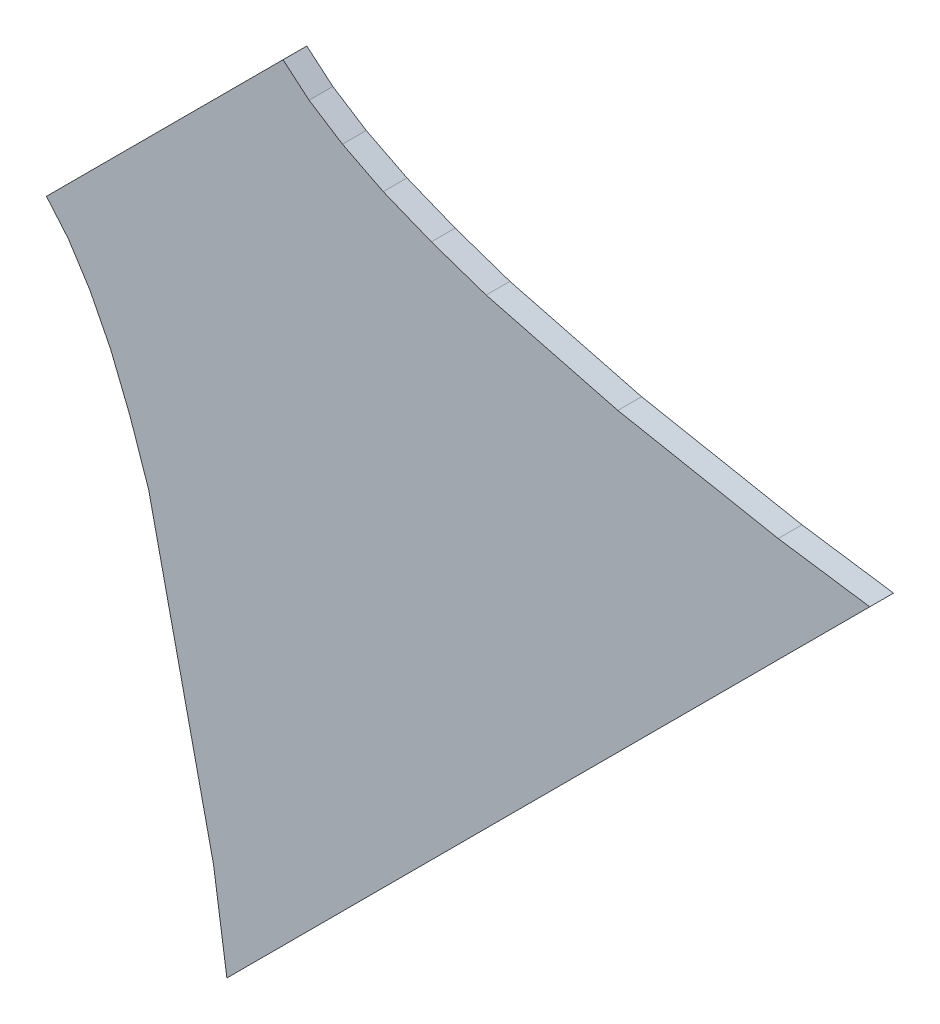
ISO-10303-21;
HEADER;
FILE_DESCRIPTION(('STEP AP214'),'2;1');
FILE_NAME('part.step','',(''),(''),'','','');
FILE_SCHEMA(('AUTOMOTIVE_DESIGN { 1 0 10303 214 1 1 1 1 }'));
ENDSEC;
DATA;
#1=APPLICATION_CONTEXT('core data for automotive mechanical design processes');
#2=APPLICATION_PROTOCOL_DEFINITION('international standard','automotive_design',2000,#1);
#3=PRODUCT_CONTEXT('',#1,'mechanical');
#4=PRODUCT('Part','Part','',(#3));
#5=PRODUCT_RELATED_PRODUCT_CATEGORY('part','',(#4));
#6=PRODUCT_DEFINITION_FORMATION('','',#4);
#7=PRODUCT_DEFINITION_CONTEXT('part definition',#1,'design');
#8=PRODUCT_DEFINITION('design','',#6,#7);
#9=PRODUCT_DEFINITION_SHAPE('','',#8);
#10=(LENGTH_UNIT() NAMED_UNIT(*) SI_UNIT(.MILLI.,.METRE.));
#11=(NAMED_UNIT(*) PLANE_ANGLE_UNIT() SI_UNIT($,.RADIAN.));
#12=(NAMED_UNIT(*) SI_UNIT($,.STERADIAN.) SOLID_ANGLE_UNIT());
#13=UNCERTAINTY_MEASURE_WITH_UNIT(LENGTH_MEASURE(1.E-05),#10,'distance_accuracy_value','');
#14=(GEOMETRIC_REPRESENTATION_CONTEXT(3) GLOBAL_UNCERTAINTY_ASSIGNED_CONTEXT((#13)) GLOBAL_UNIT_ASSIGNED_CONTEXT((#10,
#11,#12)) REPRESENTATION_CONTEXT('',''));
#15=CARTESIAN_POINT('',(0.,0.,0.));
#16=DIRECTION('',(0.,0.,1.));
#17=DIRECTION('',(1.,0.,0.));
#18=AXIS2_PLACEMENT_3D('',#15,#16,#17);
#19=CARTESIAN_POINT('',(116.087997436523,63.3779983520508,0.));
#20=DIRECTION('',(0.763321140932524,0.646019222473658,0.));
#21=DIRECTION('',(0.646019222473658,-0.763321140932524,0.));
#22=AXIS2_PLACEMENT_3D('',#19,#20,#21);
#23=PLANE('',#22);
#24=DIRECTION('',(0.646019222473658,-0.763321140932524,0.));
#25=VECTOR('',#24,1.);
#26=CARTESIAN_POINT('',(116.087997436523,63.3779983520508,0.03556));
#27=LINE('',#26,#25);
#28=CARTESIAN_POINT('',(116.087997436523,63.3779983520508,0.03556));
#29=VERTEX_POINT('',#28);
#30=CARTESIAN_POINT('',(116.121002197266,63.3390007019043,0.03556));
#31=VERTEX_POINT('',#30);
#32=EDGE_CURVE('E11',#29,#31,#27,.T.);
#33=ORIENTED_EDGE('',*,*,#32,.F.);
#34=DIRECTION('',(0.,0.,1.));
#35=VECTOR('',#34,1.);
#36=CARTESIAN_POINT('',(116.087997436523,63.3779983520508,0.));
#37=LINE('',#36,#35);
#38=CARTESIAN_POINT('',(116.087997436523,63.3779983520508,0.));
#39=VERTEX_POINT('',#38);
#40=EDGE_CURVE('E24',#39,#29,#37,.T.);
#41=ORIENTED_EDGE('',*,*,#40,.F.);
#42=DIRECTION('',(0.646019222473658,-0.763321140932524,0.));
#43=VECTOR('',#42,1.);
#44=CARTESIAN_POINT('',(116.087997436523,63.3779983520508,0.));
#45=LINE('',#44,#43);
#46=CARTESIAN_POINT('',(116.121002197266,63.3390007019043,0.));
#47=VERTEX_POINT('',#46);
#48=EDGE_CURVE('E154',#39,#47,#45,.T.);
#49=ORIENTED_EDGE('',*,*,#48,.T.);
#50=DIRECTION('',(0.,0.,1.));
#51=VECTOR('',#50,1.);
#52=CARTESIAN_POINT('',(116.121002197266,63.3390007019043,0.));
#53=LINE('',#52,#51);
#54=EDGE_CURVE('E37',#47,#31,#53,.T.);
#55=ORIENTED_EDGE('',*,*,#54,.T.);
#56=EDGE_LOOP('',(#33,#41,#49,#55));
#57=FACE_BOUND('',#56,.T.);
#58=ADVANCED_FACE('F17',(#57),#23,.F.);
#59=CARTESIAN_POINT('',(116.121002197266,63.3390007019043,0.));
#60=DIRECTION('',(0.842285405318662,0.53903181352048,0.));
#61=DIRECTION('',(0.53903181352048,-0.842285405318662,0.));
#62=AXIS2_PLACEMENT_3D('',#59,#60,#61);
#63=PLANE('',#62);
#64=DIRECTION('',(0.53903181352048,-0.842285405318662,0.));
#65=VECTOR('',#64,1.);
#66=CARTESIAN_POINT('',(116.121002197266,63.3390007019043,0.03556));
#67=LINE('',#66,#65);
#68=CARTESIAN_POINT('',(116.15299987793,63.2890014648437,0.03556));
#69=VERTEX_POINT('',#68);
#70=EDGE_CURVE('E266',#31,#69,#67,.T.);
#71=ORIENTED_EDGE('',*,*,#70,.F.);
#72=ORIENTED_EDGE('',*,*,#54,.F.);
#73=DIRECTION('',(0.53903181352048,-0.842285405318662,0.));
#74=VECTOR('',#73,1.);
#75=CARTESIAN_POINT('',(116.121002197266,63.3390007019043,0.));
#76=LINE('',#75,#74);
#77=CARTESIAN_POINT('',(116.15299987793,63.2890014648437,0.));
#78=VERTEX_POINT('',#77);
#79=EDGE_CURVE('E263',#47,#78,#76,.T.);
#80=ORIENTED_EDGE('',*,*,#79,.T.);
#81=DIRECTION('',(0.,0.,1.));
#82=VECTOR('',#81,1.);
#83=CARTESIAN_POINT('',(116.15299987793,63.2890014648437,0.));
#84=LINE('',#83,#82);
#85=EDGE_CURVE('E261',#78,#69,#84,.T.);
#86=ORIENTED_EDGE('',*,*,#85,.T.);
#87=EDGE_LOOP('',(#71,#72,#80,#86));
#88=FACE_BOUND('',#87,.T.);
#89=ADVANCED_FACE('F274',(#88),#63,.F.);
#90=CARTESIAN_POINT('',(116.15299987793,63.2890014648438,0.));
#91=DIRECTION('',(0.891498104082583,0.453024425850483,0.));
#92=DIRECTION('',(0.453024425850483,-0.891498104082583,0.));
#93=AXIS2_PLACEMENT_3D('',#90,#91,#92);
#94=PLANE('',#93);
#95=DIRECTION('',(0.453024425850483,-0.891498104082583,0.));
#96=VECTOR('',#95,1.);
#97=CARTESIAN_POINT('',(116.15299987793,63.2890014648437,0.03556));
#98=LINE('',#97,#96);
#99=CARTESIAN_POINT('',(116.18399810791,63.2280006408691,0.03556));
#100=VERTEX_POINT('',#99);
#101=EDGE_CURVE('E258',#69,#100,#98,.T.);
#102=ORIENTED_EDGE('',*,*,#101,.F.);
#103=ORIENTED_EDGE('',*,*,#85,.F.);
#104=DIRECTION('',(0.453024425850483,-0.891498104082583,0.));
#105=VECTOR('',#104,1.);
#106=CARTESIAN_POINT('',(116.15299987793,63.2890014648437,0.));
#107=LINE('',#106,#105);
#108=CARTESIAN_POINT('',(116.18399810791,63.2280006408691,0.));
#109=VERTEX_POINT('',#108);
#110=EDGE_CURVE('E255',#78,#109,#107,.T.);
#111=ORIENTED_EDGE('',*,*,#110,.T.);
#112=DIRECTION('',(0.,0.,1.));
#113=VECTOR('',#112,1.);
#114=CARTESIAN_POINT('',(116.18399810791,63.2280006408691,0.));
#115=LINE('',#114,#113);
#116=EDGE_CURVE('E253',#109,#100,#115,.T.);
#117=ORIENTED_EDGE('',*,*,#116,.T.);
#118=EDGE_LOOP('',(#102,#103,#111,#117));
#119=FACE_BOUND('',#118,.T.);
#120=ADVANCED_FACE('F280',(#119),#94,.F.);
#121=CARTESIAN_POINT('',(116.18399810791,63.2280006408691,0.));
#122=DIRECTION('',(0.927592874693312,0.373592637532109,0.));
#123=DIRECTION('',(0.373592637532109,-0.927592874693312,0.));
#124=AXIS2_PLACEMENT_3D('',#121,#122,#123);
#125=PLANE('',#124);
#126=DIRECTION('',(0.373592637532109,-0.927592874693312,0.));
#127=VECTOR('',#126,1.);
#128=CARTESIAN_POINT('',(116.18399810791,63.2280006408691,0.03556));
#129=LINE('',#128,#127);
#130=CARTESIAN_POINT('',(116.212997436523,63.1559982299805,0.03556));
#131=VERTEX_POINT('',#130);
#132=EDGE_CURVE('E250',#100,#131,#129,.T.);
#133=ORIENTED_EDGE('',*,*,#132,.F.);
#134=ORIENTED_EDGE('',*,*,#116,.F.);
#135=DIRECTION('',(0.373592637532109,-0.927592874693312,0.));
#136=VECTOR('',#135,1.);
#137=CARTESIAN_POINT('',(116.18399810791,63.2280006408691,0.));
#138=LINE('',#137,#136);
#139=CARTESIAN_POINT('',(116.212997436523,63.1559982299805,0.));
#140=VERTEX_POINT('',#139);
#141=EDGE_CURVE('E247',#109,#140,#138,.T.);
#142=ORIENTED_EDGE('',*,*,#141,.T.);
#143=DIRECTION('',(0.,0.,1.));
#144=VECTOR('',#143,1.);
#145=CARTESIAN_POINT('',(116.212997436523,63.1559982299805,0.));
#146=LINE('',#145,#144);
#147=EDGE_CURVE('E245',#140,#131,#146,.T.);
#148=ORIENTED_EDGE('',*,*,#147,.T.);
#149=EDGE_LOOP('',(#133,#134,#142,#148));
#150=FACE_BOUND('',#149,.T.);
#151=ADVANCED_FACE('F282',(#150),#125,.F.);
#152=CARTESIAN_POINT('',(116.212997436523,63.1559982299805,0.));
#153=DIRECTION('',(0.946346572220429,0.323153470113885,0.));
#154=DIRECTION('',(0.323153470113885,-0.946346572220429,0.));
#155=AXIS2_PLACEMENT_3D('',#152,#153,#154);
#156=PLANE('',#155);
#157=DIRECTION('',(0.323153470113884,-0.946346572220429,0.));
#158=VECTOR('',#157,1.);
#159=CARTESIAN_POINT('',(116.212997436523,63.1559982299805,0.03556));
#160=LINE('',#159,#158);
#161=CARTESIAN_POINT('',(116.240997314453,63.0740013122559,0.03556));
#162=VERTEX_POINT('',#161);
#163=EDGE_CURVE('E242',#131,#162,#160,.T.);
#164=ORIENTED_EDGE('',*,*,#163,.F.);
#165=ORIENTED_EDGE('',*,*,#147,.F.);
#166=DIRECTION('',(0.323153470113884,-0.946346572220429,0.));
#167=VECTOR('',#166,1.);
#168=CARTESIAN_POINT('',(116.212997436523,63.1559982299805,0.));
#169=LINE('',#168,#167);
#170=CARTESIAN_POINT('',(116.240997314453,63.0740013122559,0.));
#171=VERTEX_POINT('',#170);
#172=EDGE_CURVE('E239',#140,#171,#169,.T.);
#173=ORIENTED_EDGE('',*,*,#172,.T.);
#174=DIRECTION('',(0.,0.,1.));
#175=VECTOR('',#174,1.);
#176=CARTESIAN_POINT('',(116.240997314453,63.0740013122559,0.));
#177=LINE('',#176,#175);
#178=EDGE_CURVE('E237',#171,#162,#177,.T.);
#179=ORIENTED_EDGE('',*,*,#178,.T.);
#180=EDGE_LOOP('',(#164,#165,#173,#179));
#181=FACE_BOUND('',#180,.T.);
#182=ADVANCED_FACE('F287',(#181),#156,.F.);
#183=CARTESIAN_POINT('',(116.240997314453,63.0740013122559,0.));
#184=DIRECTION('',(0.976239566364474,0.21669404482935,0.));
#185=DIRECTION('',(0.21669404482935,-0.976239566364474,0.));
#186=AXIS2_PLACEMENT_3D('',#183,#184,#185);
#187=PLANE('',#186);
#188=DIRECTION('',(0.21669404482935,-0.976239566364474,0.));
#189=VECTOR('',#188,1.);
#190=CARTESIAN_POINT('',(116.240997314453,63.0740013122559,0.03556));
#191=LINE('',#190,#189);
#192=CARTESIAN_POINT('',(116.337997436523,62.6370010375977,0.03556));
#193=VERTEX_POINT('',#192);
#194=EDGE_CURVE('E234',#162,#193,#191,.T.);
#195=ORIENTED_EDGE('',*,*,#194,.F.);
#196=ORIENTED_EDGE('',*,*,#178,.F.);
#197=DIRECTION('',(0.21669404482935,-0.976239566364474,0.));
#198=VECTOR('',#197,1.);
#199=CARTESIAN_POINT('',(116.240997314453,63.0740013122559,0.));
#200=LINE('',#199,#198);
#201=CARTESIAN_POINT('',(116.337997436523,62.6370010375977,0.));
#202=VERTEX_POINT('',#201);
#203=EDGE_CURVE('E231',#171,#202,#200,.T.);
#204=ORIENTED_EDGE('',*,*,#203,.T.);
#205=DIRECTION('',(0.,0.,1.));
#206=VECTOR('',#205,1.);
#207=CARTESIAN_POINT('',(116.337997436523,62.6370010375977,0.));
#208=LINE('',#207,#206);
#209=EDGE_CURVE('E229',#202,#193,#208,.T.);
#210=ORIENTED_EDGE('',*,*,#209,.T.);
#211=EDGE_LOOP('',(#195,#196,#204,#210));
#212=FACE_BOUND('',#211,.T.);
#213=ADVANCED_FACE('F290',(#212),#187,.F.);
#214=CARTESIAN_POINT('',(116.337997436523,62.6370010375977,0.));
#215=DIRECTION('',(0.989507228145711,0.144483374294039,0.));
#216=DIRECTION('',(0.144483374294039,-0.989507228145711,0.));
#217=AXIS2_PLACEMENT_3D('',#214,#215,#216);
#218=PLANE('',#217);
#219=DIRECTION('',(0.144483374294039,-0.989507228145711,0.));
#220=VECTOR('',#219,1.);
#221=CARTESIAN_POINT('',(116.337997436523,62.6370010375977,0.03556));
#222=LINE('',#221,#220);
#223=CARTESIAN_POINT('',(116.358001708984,62.5,0.03556));
#224=VERTEX_POINT('',#223);
#225=EDGE_CURVE('E226',#193,#224,#222,.T.);
#226=ORIENTED_EDGE('',*,*,#225,.F.);
#227=ORIENTED_EDGE('',*,*,#209,.F.);
#228=DIRECTION('',(0.144483374294039,-0.989507228145711,0.));
#229=VECTOR('',#228,1.);
#230=CARTESIAN_POINT('',(116.337997436523,62.6370010375977,0.));
#231=LINE('',#230,#229);
#232=CARTESIAN_POINT('',(116.358001708984,62.5,0.));
#233=VERTEX_POINT('',#232);
#234=EDGE_CURVE('E223',#202,#233,#231,.T.);
#235=ORIENTED_EDGE('',*,*,#234,.T.);
#236=DIRECTION('',(0.,0.,1.));
#237=VECTOR('',#236,1.);
#238=CARTESIAN_POINT('',(116.358001708984,62.5,0.));
#239=LINE('',#238,#237);
#240=EDGE_CURVE('E221',#233,#224,#239,.T.);
#241=ORIENTED_EDGE('',*,*,#240,.T.);
#242=EDGE_LOOP('',(#226,#227,#235,#241));
#243=FACE_BOUND('',#242,.T.);
#244=ADVANCED_FACE('F295',(#243),#218,.F.);
#245=CARTESIAN_POINT('',(116.358001708984,62.5,0.));
#246=DIRECTION('',(-0.707108183159484,0.707105379210831,0.));
#247=DIRECTION('',(0.707105379210831,0.707108183159484,0.));
#248=AXIS2_PLACEMENT_3D('',#245,#246,#247);
#249=PLANE('',#248);
#250=DIRECTION('',(0.707105379210831,0.707108183159484,0.));
#251=VECTOR('',#250,1.);
#252=CARTESIAN_POINT('',(116.358001708984,62.5,0.03556));
#253=LINE('',#252,#251);
#254=CARTESIAN_POINT('',(117.319999694824,63.4620018005371,0.03556));
#255=VERTEX_POINT('',#254);
#256=EDGE_CURVE('E218',#224,#255,#253,.T.);
#257=ORIENTED_EDGE('',*,*,#256,.F.);
#258=ORIENTED_EDGE('',*,*,#240,.F.);
#259=DIRECTION('',(0.707105379210831,0.707108183159484,0.));
#260=VECTOR('',#259,1.);
#261=CARTESIAN_POINT('',(116.358001708984,62.5,0.));
#262=LINE('',#261,#260);
#263=CARTESIAN_POINT('',(117.319999694824,63.4620018005371,0.));
#264=VERTEX_POINT('',#263);
#265=EDGE_CURVE('E215',#233,#264,#262,.T.);
#266=ORIENTED_EDGE('',*,*,#265,.T.);
#267=DIRECTION('',(0.,0.,1.));
#268=VECTOR('',#267,1.);
#269=CARTESIAN_POINT('',(117.319999694824,63.4620018005371,0.));
#270=LINE('',#269,#268);
#271=EDGE_CURVE('E213',#264,#255,#270,.T.);
#272=ORIENTED_EDGE('',*,*,#271,.T.);
#273=EDGE_LOOP('',(#257,#258,#266,#272));
#274=FACE_BOUND('',#273,.T.);
#275=ADVANCED_FACE('F298',(#274),#249,.F.);
#276=CARTESIAN_POINT('',(117.319999694824,63.4620018005371,0.));
#277=DIRECTION('',(-0.144429419714034,-0.989515104847353,0.));
#278=DIRECTION('',(-0.989515104847353,0.144429419714034,0.));
#279=AXIS2_PLACEMENT_3D('',#276,#277,#278);
#280=PLANE('',#279);
#281=DIRECTION('',(-0.989515104847353,0.144429419714034,0.));
#282=VECTOR('',#281,1.);
#283=CARTESIAN_POINT('',(117.319999694824,63.4620018005371,0.03556));
#284=LINE('',#283,#282);
#285=CARTESIAN_POINT('',(117.182998657227,63.4819984436035,0.03556));
#286=VERTEX_POINT('',#285);
#287=EDGE_CURVE('E210',#255,#286,#284,.T.);
#288=ORIENTED_EDGE('',*,*,#287,.F.);
#289=ORIENTED_EDGE('',*,*,#271,.F.);
#290=DIRECTION('',(-0.989515104847353,0.144429419714034,0.));
#291=VECTOR('',#290,1.);
#292=CARTESIAN_POINT('',(117.319999694824,63.4620018005371,0.));
#293=LINE('',#292,#291);
#294=CARTESIAN_POINT('',(117.182998657227,63.4819984436035,0.));
#295=VERTEX_POINT('',#294);
#296=EDGE_CURVE('E207',#264,#295,#293,.T.);
#297=ORIENTED_EDGE('',*,*,#296,.T.);
#298=DIRECTION('',(0.,0.,1.));
#299=VECTOR('',#298,1.);
#300=CARTESIAN_POINT('',(117.182998657227,63.4819984436035,0.));
#301=LINE('',#300,#299);
#302=EDGE_CURVE('E205',#295,#286,#301,.T.);
#303=ORIENTED_EDGE('',*,*,#302,.T.);
#304=EDGE_LOOP('',(#288,#289,#297,#303));
#305=FACE_BOUND('',#304,.T.);
#306=ADVANCED_FACE('F303',(#305),#280,.F.);
#307=CARTESIAN_POINT('',(117.182998657227,63.4819984436035,0.));
#308=DIRECTION('',(-0.188247521686803,-0.982121617000042,0.));
#309=DIRECTION('',(-0.982121617000042,0.188247521686803,0.));
#310=AXIS2_PLACEMENT_3D('',#307,#308,#309);
#311=PLANE('',#310);
#312=DIRECTION('',(-0.982121617000042,0.188247521686803,0.));
#313=VECTOR('',#312,1.);
#314=CARTESIAN_POINT('',(117.182998657227,63.4819984436035,0.03556));
#315=LINE('',#314,#313);
#316=CARTESIAN_POINT('',(116.943000793457,63.5279998779297,0.03556));
#317=VERTEX_POINT('',#316);
#318=EDGE_CURVE('E202',#286,#317,#315,.T.);
#319=ORIENTED_EDGE('',*,*,#318,.F.);
#320=ORIENTED_EDGE('',*,*,#302,.F.);
#321=DIRECTION('',(-0.982121617000042,0.188247521686803,0.));
#322=VECTOR('',#321,1.);
#323=CARTESIAN_POINT('',(117.182998657227,63.4819984436035,0.));
#324=LINE('',#323,#322);
#325=CARTESIAN_POINT('',(116.943000793457,63.5279998779297,0.));
#326=VERTEX_POINT('',#325);
#327=EDGE_CURVE('E199',#295,#326,#324,.T.);
#328=ORIENTED_EDGE('',*,*,#327,.T.);
#329=DIRECTION('',(0.,0.,1.));
#330=VECTOR('',#329,1.);
#331=CARTESIAN_POINT('',(116.943000793457,63.5279998779297,0.));
#332=LINE('',#331,#330);
#333=EDGE_CURVE('E197',#326,#317,#332,.T.);
#334=ORIENTED_EDGE('',*,*,#333,.T.);
#335=EDGE_LOOP('',(#319,#320,#328,#334));
#336=FACE_BOUND('',#335,.T.);
#337=ADVANCED_FACE('F306',(#336),#311,.F.);
#338=CARTESIAN_POINT('',(116.943000793457,63.5279998779297,0.));
#339=DIRECTION('',(-0.250616689178286,-0.96808639857469,0.));
#340=DIRECTION('',(-0.96808639857469,0.250616689178286,0.));
#341=AXIS2_PLACEMENT_3D('',#338,#339,#340);
#342=PLANE('',#341);
#343=DIRECTION('',(-0.96808639857469,0.250616689178286,0.));
#344=VECTOR('',#343,1.);
#345=CARTESIAN_POINT('',(116.943000793457,63.5279998779297,0.03556));
#346=LINE('',#345,#344);
#347=CARTESIAN_POINT('',(116.746002197266,63.5789985656738,0.03556));
#348=VERTEX_POINT('',#347);
#349=EDGE_CURVE('E194',#317,#348,#346,.T.);
#350=ORIENTED_EDGE('',*,*,#349,.F.);
#351=ORIENTED_EDGE('',*,*,#333,.F.);
#352=DIRECTION('',(-0.96808639857469,0.250616689178286,0.));
#353=VECTOR('',#352,1.);
#354=CARTESIAN_POINT('',(116.943000793457,63.5279998779297,0.));
#355=LINE('',#354,#353);
#356=CARTESIAN_POINT('',(116.746002197266,63.5789985656738,0.));
#357=VERTEX_POINT('',#356);
#358=EDGE_CURVE('E191',#326,#357,#355,.T.);
#359=ORIENTED_EDGE('',*,*,#358,.T.);
#360=DIRECTION('',(0.,0.,1.));
#361=VECTOR('',#360,1.);
#362=CARTESIAN_POINT('',(116.746002197266,63.5789985656738,0.));
#363=LINE('',#362,#361);
#364=EDGE_CURVE('E189',#357,#348,#363,.T.);
#365=ORIENTED_EDGE('',*,*,#364,.T.);
#366=EDGE_LOOP('',(#350,#351,#359,#365));
#367=FACE_BOUND('',#366,.T.);
#368=ADVANCED_FACE('F311',(#367),#342,.F.);
#369=CARTESIAN_POINT('',(116.746002197266,63.5789985656738,0.));
#370=DIRECTION('',(-0.323140006713482,-0.946351169524934,0.));
#371=DIRECTION('',(-0.946351169524934,0.323140006713482,0.));
#372=AXIS2_PLACEMENT_3D('',#369,#370,#371);
#373=PLANE('',#372);
#374=DIRECTION('',(-0.946351169524934,0.323140006713482,0.));
#375=VECTOR('',#374,1.);
#376=CARTESIAN_POINT('',(116.746002197266,63.5789985656738,0.03556));
#377=LINE('',#376,#375);
#378=CARTESIAN_POINT('',(116.664001464844,63.6069984436035,0.03556));
#379=VERTEX_POINT('',#378);
#380=EDGE_CURVE('E186',#348,#379,#377,.T.);
#381=ORIENTED_EDGE('',*,*,#380,.F.);
#382=ORIENTED_EDGE('',*,*,#364,.F.);
#383=DIRECTION('',(-0.946351169524934,0.323140006713482,0.));
#384=VECTOR('',#383,1.);
#385=CARTESIAN_POINT('',(116.746002197266,63.5789985656738,0.));
#386=LINE('',#385,#384);
#387=CARTESIAN_POINT('',(116.664001464844,63.6069984436035,0.));
#388=VERTEX_POINT('',#387);
#389=EDGE_CURVE('E183',#357,#388,#386,.T.);
#390=ORIENTED_EDGE('',*,*,#389,.T.);
#391=DIRECTION('',(0.,0.,1.));
#392=VECTOR('',#391,1.);
#393=CARTESIAN_POINT('',(116.664001464844,63.6069984436035,0.));
#394=LINE('',#393,#392);
#395=EDGE_CURVE('E181',#388,#379,#394,.T.);
#396=ORIENTED_EDGE('',*,*,#395,.T.);
#397=EDGE_LOOP('',(#381,#382,#390,#396));
#398=FACE_BOUND('',#397,.T.);
#399=ADVANCED_FACE('F314',(#398),#373,.F.);
#400=CARTESIAN_POINT('',(116.664001464844,63.6069984436035,0.));
#401=DIRECTION('',(-0.373651953728889,-0.927568982596219,0.));
#402=DIRECTION('',(-0.927568982596219,0.373651953728889,0.));
#403=AXIS2_PLACEMENT_3D('',#400,#401,#402);
#404=PLANE('',#403);
#405=DIRECTION('',(-0.927568982596219,0.373651953728889,0.));
#406=VECTOR('',#405,1.);
#407=CARTESIAN_POINT('',(116.664001464844,63.6069984436035,0.03556));
#408=LINE('',#407,#406);
#409=CARTESIAN_POINT('',(116.592002868652,63.6360015869141,0.03556));
#410=VERTEX_POINT('',#409);
#411=EDGE_CURVE('E178',#379,#410,#408,.T.);
#412=ORIENTED_EDGE('',*,*,#411,.F.);
#413=ORIENTED_EDGE('',*,*,#395,.F.);
#414=DIRECTION('',(-0.927568982596219,0.373651953728889,0.));
#415=VECTOR('',#414,1.);
#416=CARTESIAN_POINT('',(116.664001464844,63.6069984436035,0.));
#417=LINE('',#416,#415);
#418=CARTESIAN_POINT('',(116.592002868652,63.6360015869141,0.));
#419=VERTEX_POINT('',#418);
#420=EDGE_CURVE('E175',#388,#419,#417,.T.);
#421=ORIENTED_EDGE('',*,*,#420,.T.);
#422=DIRECTION('',(0.,0.,1.));
#423=VECTOR('',#422,1.);
#424=CARTESIAN_POINT('',(116.592002868652,63.6360015869141,0.));
#425=LINE('',#424,#423);
#426=EDGE_CURVE('E173',#419,#410,#425,.T.);
#427=ORIENTED_EDGE('',*,*,#426,.T.);
#428=EDGE_LOOP('',(#412,#413,#421,#427));
#429=FACE_BOUND('',#428,.T.);
#430=ADVANCED_FACE('F319',(#429),#404,.F.);
#431=CARTESIAN_POINT('',(116.592002868652,63.6360015869141,0.));
#432=DIRECTION('',(-0.453001911052971,-0.891509544863293,0.));
#433=DIRECTION('',(-0.891509544863293,0.453001911052971,0.));
#434=AXIS2_PLACEMENT_3D('',#431,#432,#433);
#435=PLANE('',#434);
#436=DIRECTION('',(-0.891509544863293,0.453001911052971,0.));
#437=VECTOR('',#436,1.);
#438=CARTESIAN_POINT('',(116.592002868652,63.6360015869141,0.03556));
#439=LINE('',#438,#437);
#440=CARTESIAN_POINT('',(116.53099822998,63.6669998168945,0.03556));
#441=VERTEX_POINT('',#440);
#442=EDGE_CURVE('E170',#410,#441,#439,.T.);
#443=ORIENTED_EDGE('',*,*,#442,.F.);
#444=ORIENTED_EDGE('',*,*,#426,.F.);
#445=DIRECTION('',(-0.891509544863293,0.453001911052971,0.));
#446=VECTOR('',#445,1.);
#447=CARTESIAN_POINT('',(116.592002868652,63.6360015869141,0.));
#448=LINE('',#447,#446);
#449=CARTESIAN_POINT('',(116.53099822998,63.6669998168945,0.));
#450=VERTEX_POINT('',#449);
#451=EDGE_CURVE('E167',#419,#450,#448,.T.);
#452=ORIENTED_EDGE('',*,*,#451,.T.);
#453=DIRECTION('',(0.,0.,1.));
#454=VECTOR('',#453,1.);
#455=CARTESIAN_POINT('',(116.53099822998,63.6669998168945,0.));
#456=LINE('',#455,#454);
#457=EDGE_CURVE('E165',#450,#441,#456,.T.);
#458=ORIENTED_EDGE('',*,*,#457,.T.);
#459=EDGE_LOOP('',(#443,#444,#452,#458));
#460=FACE_BOUND('',#459,.T.);
#461=ADVANCED_FACE('F322',(#460),#435,.F.);
#462=CARTESIAN_POINT('',(116.53099822998,63.6669998168945,0.));
#463=DIRECTION('',(-0.539106579633518,-0.84223755306674,0.));
#464=DIRECTION('',(-0.84223755306674,0.539106579633518,0.));
#465=AXIS2_PLACEMENT_3D('',#462,#463,#464);
#466=PLANE('',#465);
#467=DIRECTION('',(-0.84223755306674,0.539106579633518,0.));
#468=VECTOR('',#467,1.);
#469=CARTESIAN_POINT('',(116.53099822998,63.6669998168945,0.03556));
#470=LINE('',#469,#468);
#471=CARTESIAN_POINT('',(116.481002807617,63.6990013122559,0.03556));
#472=VERTEX_POINT('',#471);
#473=EDGE_CURVE('E162',#441,#472,#470,.T.);
#474=ORIENTED_EDGE('',*,*,#473,.F.);
#475=ORIENTED_EDGE('',*,*,#457,.F.);
#476=DIRECTION('',(-0.84223755306674,0.539106579633518,0.));
#477=VECTOR('',#476,1.);
#478=CARTESIAN_POINT('',(116.53099822998,63.6669998168945,0.));
#479=LINE('',#478,#477);
#480=CARTESIAN_POINT('',(116.481002807617,63.6990013122559,0.));
#481=VERTEX_POINT('',#480);
#482=EDGE_CURVE('E160',#450,#481,#479,.T.);
#483=ORIENTED_EDGE('',*,*,#482,.T.);
#484=DIRECTION('',(0.,0.,1.));
#485=VECTOR('',#484,1.);
#486=CARTESIAN_POINT('',(116.481002807617,63.6990013122559,0.));
#487=LINE('',#486,#485);
#488=EDGE_CURVE('E145',#481,#472,#487,.T.);
#489=ORIENTED_EDGE('',*,*,#488,.T.);
#490=EDGE_LOOP('',(#474,#475,#483,#489));
#491=FACE_BOUND('',#490,.T.);
#492=ADVANCED_FACE('F325',(#491),#466,.F.);
#493=CARTESIAN_POINT('',(116.481002807617,63.6990013122559,0.));
#494=DIRECTION('',(-0.645895378395862,-0.763425936268127,0.));
#495=DIRECTION('',(-0.763425936268127,0.645895378395862,0.));
#496=AXIS2_PLACEMENT_3D('',#493,#494,#495);
#497=PLANE('',#496);
#498=DIRECTION('',(-0.763425936268127,0.645895378395862,0.));
#499=VECTOR('',#498,1.);
#500=CARTESIAN_POINT('',(116.481002807617,63.6990013122559,0.03556));
#501=LINE('',#500,#499);
#502=CARTESIAN_POINT('',(116.442001342773,63.7319984436035,0.03556));
#503=VERTEX_POINT('',#502);
#504=EDGE_CURVE('E149',#472,#503,#501,.T.);
#505=ORIENTED_EDGE('',*,*,#504,.F.);
#506=ORIENTED_EDGE('',*,*,#488,.F.);
#507=DIRECTION('',(-0.763425936268127,0.645895378395862,0.));
#508=VECTOR('',#507,1.);
#509=CARTESIAN_POINT('',(116.481002807617,63.6990013122559,0.));
#510=LINE('',#509,#508);
#511=CARTESIAN_POINT('',(116.442001342773,63.7319984436035,0.));
#512=VERTEX_POINT('',#511);
#513=EDGE_CURVE('E141',#481,#512,#510,.T.);
#514=ORIENTED_EDGE('',*,*,#513,.T.);
#515=DIRECTION('',(0.,0.,1.));
#516=VECTOR('',#515,1.);
#517=CARTESIAN_POINT('',(116.442001342773,63.7319984436035,0.));
#518=LINE('',#517,#516);
#519=EDGE_CURVE('E131',#512,#503,#518,.T.);
#520=ORIENTED_EDGE('',*,*,#519,.T.);
#521=EDGE_LOOP('',(#505,#506,#514,#520));
#522=FACE_BOUND('',#521,.T.);
#523=ADVANCED_FACE('F144',(#522),#497,.F.);
#524=CARTESIAN_POINT('',(116.442001342773,63.7319984436035,0.));
#525=DIRECTION('',(0.707102971313186,-0.707110591039382,0.));
#526=DIRECTION('',(-0.707110591039382,-0.707102971313186,0.));
#527=AXIS2_PLACEMENT_3D('',#524,#525,#526);
#528=PLANE('',#527);
#529=DIRECTION('',(-0.707110591039382,-0.707102971313186,0.));
#530=VECTOR('',#529,1.);
#531=CARTESIAN_POINT('',(116.442001342773,63.7319984436035,0.03556));
#532=LINE('',#531,#530);
#533=EDGE_CURVE('E137',#503,#29,#532,.T.);
#534=ORIENTED_EDGE('',*,*,#533,.F.);
#535=ORIENTED_EDGE('',*,*,#519,.F.);
#536=DIRECTION('',(-0.707110591039382,-0.707102971313186,0.));
#537=VECTOR('',#536,1.);
#538=CARTESIAN_POINT('',(116.442001342773,63.7319984436035,0.));
#539=LINE('',#538,#537);
#540=EDGE_CURVE('E135',#512,#39,#539,.T.);
#541=ORIENTED_EDGE('',*,*,#540,.T.);
#542=ORIENTED_EDGE('',*,*,#40,.T.);
#543=EDGE_LOOP('',(#534,#535,#541,#542));
#544=FACE_BOUND('',#543,.T.);
#545=ADVANCED_FACE('F133',(#544),#528,.F.);
#546=CARTESIAN_POINT('',(116.087997436523,63.3779983520508,0.));
#547=DIRECTION('',(0.,0.,1.));
#548=DIRECTION('',(1.,0.,0.));
#549=AXIS2_PLACEMENT_3D('',#546,#547,#548);
#550=PLANE('',#549);
#551=ORIENTED_EDGE('',*,*,#540,.F.);
#552=ORIENTED_EDGE('',*,*,#513,.F.);
#553=ORIENTED_EDGE('',*,*,#482,.F.);
#554=ORIENTED_EDGE('',*,*,#451,.F.);
#555=ORIENTED_EDGE('',*,*,#420,.F.);
#556=ORIENTED_EDGE('',*,*,#389,.F.);
#557=ORIENTED_EDGE('',*,*,#358,.F.);
#558=ORIENTED_EDGE('',*,*,#327,.F.);
#559=ORIENTED_EDGE('',*,*,#296,.F.);
#560=ORIENTED_EDGE('',*,*,#265,.F.);
#561=ORIENTED_EDGE('',*,*,#234,.F.);
#562=ORIENTED_EDGE('',*,*,#203,.F.);
#563=ORIENTED_EDGE('',*,*,#172,.F.);
#564=ORIENTED_EDGE('',*,*,#141,.F.);
#565=ORIENTED_EDGE('',*,*,#110,.F.);
#566=ORIENTED_EDGE('',*,*,#79,.F.);
#567=ORIENTED_EDGE('',*,*,#48,.F.);
#568=EDGE_LOOP('',(#551,#552,#553,#554,#555,#556,#557,#558,#559,#560,#561,#562,#563,#564,#565,
#566,#567));
#569=FACE_BOUND('',#568,.T.);
#570=ADVANCED_FACE('F152',(#569),#550,.F.);
#571=CARTESIAN_POINT('',(116.087997436523,63.3779983520508,0.03556));
#572=DIRECTION('',(0.,0.,1.));
#573=DIRECTION('',(1.,0.,0.));
#574=AXIS2_PLACEMENT_3D('',#571,#572,#573);
#575=PLANE('',#574);
#576=ORIENTED_EDGE('',*,*,#32,.T.);
#577=ORIENTED_EDGE('',*,*,#70,.T.);
#578=ORIENTED_EDGE('',*,*,#101,.T.);
#579=ORIENTED_EDGE('',*,*,#132,.T.);
#580=ORIENTED_EDGE('',*,*,#163,.T.);
#581=ORIENTED_EDGE('',*,*,#194,.T.);
#582=ORIENTED_EDGE('',*,*,#225,.T.);
#583=ORIENTED_EDGE('',*,*,#256,.T.);
#584=ORIENTED_EDGE('',*,*,#287,.T.);
#585=ORIENTED_EDGE('',*,*,#318,.T.);
#586=ORIENTED_EDGE('',*,*,#349,.T.);
#587=ORIENTED_EDGE('',*,*,#380,.T.);
#588=ORIENTED_EDGE('',*,*,#411,.T.);
#589=ORIENTED_EDGE('',*,*,#442,.T.);
#590=ORIENTED_EDGE('',*,*,#473,.T.);
#591=ORIENTED_EDGE('',*,*,#504,.T.);
#592=ORIENTED_EDGE('',*,*,#533,.T.);
#593=EDGE_LOOP('',(#576,#577,#578,#579,#580,#581,#582,#583,#584,#585,#586,#587,#588,#589,#590,
#591,#592));
#594=FACE_BOUND('',#593,.T.);
#595=ADVANCED_FACE('F277',(#594),#575,.T.);
#596=CLOSED_SHELL('',(#58,#89,#120,#151,#182,#213,#244,#275,#306,#337,#368,#399,#430,#461,#492,
#523,#545,#570,#595));
#597=MANIFOLD_SOLID_BREP('B1',#596);
#598=ADVANCED_BREP_SHAPE_REPRESENTATION('',(#18,#597),#14);
#599=SHAPE_DEFINITION_REPRESENTATION(#9,#598);
ENDSEC;
END-ISO-10303-21;
